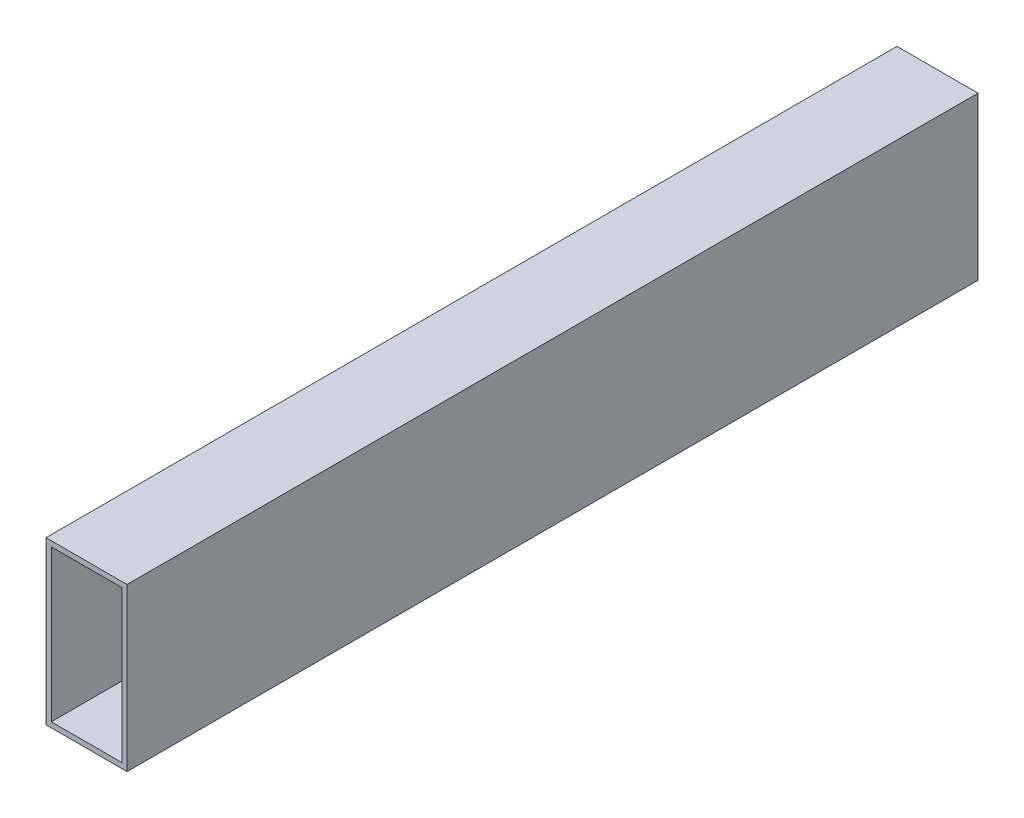
ISO-10303-21;
HEADER;
FILE_DESCRIPTION(('STEP AP214'),'2;1');
FILE_NAME('part.step','',(''),(''),'','','');
FILE_SCHEMA(('AUTOMOTIVE_DESIGN { 1 0 10303 214 1 1 1 1 }'));
ENDSEC;
DATA;
#1=APPLICATION_CONTEXT('core data for automotive mechanical design processes');
#2=APPLICATION_PROTOCOL_DEFINITION('international standard','automotive_design',2000,#1);
#3=PRODUCT_CONTEXT('',#1,'mechanical');
#4=PRODUCT('Part','Part','',(#3));
#5=PRODUCT_RELATED_PRODUCT_CATEGORY('part','',(#4));
#6=PRODUCT_DEFINITION_FORMATION('','',#4);
#7=PRODUCT_DEFINITION_CONTEXT('part definition',#1,'design');
#8=PRODUCT_DEFINITION('design','',#6,#7);
#9=PRODUCT_DEFINITION_SHAPE('','',#8);
#10=(LENGTH_UNIT() NAMED_UNIT(*) SI_UNIT(.MILLI.,.METRE.));
#11=(NAMED_UNIT(*) PLANE_ANGLE_UNIT() SI_UNIT($,.RADIAN.));
#12=(NAMED_UNIT(*) SI_UNIT($,.STERADIAN.) SOLID_ANGLE_UNIT());
#13=UNCERTAINTY_MEASURE_WITH_UNIT(LENGTH_MEASURE(1.E-05),#10,'distance_accuracy_value','');
#14=(GEOMETRIC_REPRESENTATION_CONTEXT(3) GLOBAL_UNCERTAINTY_ASSIGNED_CONTEXT((#13)) GLOBAL_UNIT_ASSIGNED_CONTEXT((#10,
#11,#12)) REPRESENTATION_CONTEXT('',''));
#15=CARTESIAN_POINT('',(0.,0.,0.));
#16=DIRECTION('',(0.,0.,1.));
#17=DIRECTION('',(1.,0.,0.));
#18=AXIS2_PLACEMENT_3D('',#15,#16,#17);
#19=CARTESIAN_POINT('',(-48.4372093023255,-30.1994186046511,266.7));
#20=DIRECTION('',(1.,0.,0.));
#21=DIRECTION('',(0.,0.,-1.));
#22=AXIS2_PLACEMENT_3D('',#19,#20,#21);
#23=PLANE('',#22);
#24=DIRECTION('',(0.,-1.,0.));
#25=VECTOR('',#24,1.);
#26=CARTESIAN_POINT('',(-48.4372093023255,-30.1994186046511,0.));
#27=LINE('',#26,#25);
#28=CARTESIAN_POINT('',(-48.4372093023255,20.6005813953489,0.));
#29=VERTEX_POINT('',#28);
#30=CARTESIAN_POINT('',(-48.4372093023255,-30.1994186046511,0.));
#31=VERTEX_POINT('',#30);
#32=EDGE_CURVE('E132',#29,#31,#27,.T.);
#33=ORIENTED_EDGE('',*,*,#32,.T.);
#34=DIRECTION('',(0.,0.,-1.));
#35=VECTOR('',#34,1.);
#36=CARTESIAN_POINT('',(-48.4372093023255,-30.1994186046511,266.7));
#37=LINE('',#36,#35);
#38=CARTESIAN_POINT('',(-48.4372093023255,-30.1994186046511,266.7));
#39=VERTEX_POINT('',#38);
#40=EDGE_CURVE('E11',#39,#31,#37,.T.);
#41=ORIENTED_EDGE('',*,*,#40,.F.);
#42=DIRECTION('',(0.,-1.,0.));
#43=VECTOR('',#42,1.);
#44=CARTESIAN_POINT('',(-48.4372093023255,-30.1994186046511,266.7));
#45=LINE('',#44,#43);
#46=CARTESIAN_POINT('',(-48.4372093023255,20.6005813953489,266.7));
#47=VERTEX_POINT('',#46);
#48=EDGE_CURVE('E136',#47,#39,#45,.T.);
#49=ORIENTED_EDGE('',*,*,#48,.F.);
#50=DIRECTION('',(0.,0.,-1.));
#51=VECTOR('',#50,1.);
#52=CARTESIAN_POINT('',(-48.4372093023255,20.6005813953489,266.7));
#53=LINE('',#52,#51);
#54=EDGE_CURVE('E146',#47,#29,#53,.T.);
#55=ORIENTED_EDGE('',*,*,#54,.T.);
#56=EDGE_LOOP('',(#33,#41,#49,#55));
#57=FACE_BOUND('',#56,.T.);
#58=ADVANCED_FACE('F35',(#57),#23,.F.);
#59=CARTESIAN_POINT('',(-48.4372093023255,-30.1994186046511,266.7));
#60=DIRECTION('',(0.,1.,0.));
#61=DIRECTION('',(0.,0.,1.));
#62=AXIS2_PLACEMENT_3D('',#59,#60,#61);
#63=PLANE('',#62);
#64=DIRECTION('',(1.,0.,0.));
#65=VECTOR('',#64,1.);
#66=CARTESIAN_POINT('',(-48.4372093023255,-30.1994186046511,0.));
#67=LINE('',#66,#65);
#68=CARTESIAN_POINT('',(-23.0372093023255,-30.1994186046511,0.));
#69=VERTEX_POINT('',#68);
#70=EDGE_CURVE('E149',#31,#69,#67,.T.);
#71=ORIENTED_EDGE('',*,*,#70,.T.);
#72=DIRECTION('',(0.,0.,-1.));
#73=VECTOR('',#72,1.);
#74=CARTESIAN_POINT('',(-23.0372093023255,-30.1994186046511,266.7));
#75=LINE('',#74,#73);
#76=CARTESIAN_POINT('',(-23.0372093023255,-30.1994186046511,266.7));
#77=VERTEX_POINT('',#76);
#78=EDGE_CURVE('E42',#77,#69,#75,.T.);
#79=ORIENTED_EDGE('',*,*,#78,.F.);
#80=DIRECTION('',(1.,0.,0.));
#81=VECTOR('',#80,1.);
#82=CARTESIAN_POINT('',(-48.4372093023255,-30.1994186046511,266.7));
#83=LINE('',#82,#81);
#84=EDGE_CURVE('E139',#39,#77,#83,.T.);
#85=ORIENTED_EDGE('',*,*,#84,.F.);
#86=ORIENTED_EDGE('',*,*,#40,.T.);
#87=EDGE_LOOP('',(#71,#79,#85,#86));
#88=FACE_BOUND('',#87,.T.);
#89=ADVANCED_FACE('F177',(#88),#63,.F.);
#90=CARTESIAN_POINT('',(-23.0372093023255,-30.1994186046511,266.7));
#91=DIRECTION('',(-1.,0.,0.));
#92=DIRECTION('',(0.,-1.,0.));
#93=AXIS2_PLACEMENT_3D('',#90,#91,#92);
#94=PLANE('',#93);
#95=DIRECTION('',(0.,1.,0.));
#96=VECTOR('',#95,1.);
#97=CARTESIAN_POINT('',(-23.0372093023255,-30.1994186046511,0.));
#98=LINE('',#97,#96);
#99=CARTESIAN_POINT('',(-23.0372093023255,20.6005813953489,0.));
#100=VERTEX_POINT('',#99);
#101=EDGE_CURVE('E151',#69,#100,#98,.T.);
#102=ORIENTED_EDGE('',*,*,#101,.T.);
#103=DIRECTION('',(0.,0.,-1.));
#104=VECTOR('',#103,1.);
#105=CARTESIAN_POINT('',(-23.0372093023255,20.6005813953489,266.7));
#106=LINE('',#105,#104);
#107=CARTESIAN_POINT('',(-23.0372093023255,20.6005813953489,266.7));
#108=VERTEX_POINT('',#107);
#109=EDGE_CURVE('E156',#108,#100,#106,.T.);
#110=ORIENTED_EDGE('',*,*,#109,.F.);
#111=DIRECTION('',(0.,1.,0.));
#112=VECTOR('',#111,1.);
#113=CARTESIAN_POINT('',(-23.0372093023255,-30.1994186046511,266.7));
#114=LINE('',#113,#112);
#115=EDGE_CURVE('E142',#77,#108,#114,.T.);
#116=ORIENTED_EDGE('',*,*,#115,.F.);
#117=ORIENTED_EDGE('',*,*,#78,.T.);
#118=EDGE_LOOP('',(#102,#110,#116,#117));
#119=FACE_BOUND('',#118,.T.);
#120=ADVANCED_FACE('F163',(#119),#94,.F.);
#121=CARTESIAN_POINT('',(-48.4372093023255,20.6005813953489,266.7));
#122=DIRECTION('',(0.,-1.,0.));
#123=DIRECTION('',(0.,0.,-1.));
#124=AXIS2_PLACEMENT_3D('',#121,#122,#123);
#125=PLANE('',#124);
#126=DIRECTION('',(-1.,0.,0.));
#127=VECTOR('',#126,1.);
#128=CARTESIAN_POINT('',(-48.4372093023255,20.6005813953489,0.));
#129=LINE('',#128,#127);
#130=EDGE_CURVE('E140',#100,#29,#129,.T.);
#131=ORIENTED_EDGE('',*,*,#130,.T.);
#132=ORIENTED_EDGE('',*,*,#54,.F.);
#133=DIRECTION('',(-1.,0.,0.));
#134=VECTOR('',#133,1.);
#135=CARTESIAN_POINT('',(-48.4372093023255,20.6005813953489,266.7));
#136=LINE('',#135,#134);
#137=EDGE_CURVE('E144',#108,#47,#136,.T.);
#138=ORIENTED_EDGE('',*,*,#137,.F.);
#139=ORIENTED_EDGE('',*,*,#109,.T.);
#140=EDGE_LOOP('',(#131,#132,#138,#139));
#141=FACE_BOUND('',#140,.T.);
#142=ADVANCED_FACE('F170',(#141),#125,.F.);
#143=CARTESIAN_POINT('',(0.,0.,266.7));
#144=DIRECTION('',(0.,0.,-1.));
#145=DIRECTION('',(-1.,0.,0.));
#146=AXIS2_PLACEMENT_3D('',#143,#144,#145);
#147=PLANE('',#146);
#148=DIRECTION('',(-1.,0.,0.));
#149=VECTOR('',#148,1.);
#150=CARTESIAN_POINT('',(-46.7862093023255,18.9495813953489,266.7));
#151=LINE('',#150,#149);
#152=CARTESIAN_POINT('',(-24.6882093023255,18.9495813953489,266.7));
#153=VERTEX_POINT('',#152);
#154=CARTESIAN_POINT('',(-46.7862093023255,18.9495813953489,266.7));
#155=VERTEX_POINT('',#154);
#156=EDGE_CURVE('E126',#153,#155,#151,.T.);
#157=ORIENTED_EDGE('',*,*,#156,.F.);
#158=DIRECTION('',(0.,1.,0.));
#159=VECTOR('',#158,1.);
#160=CARTESIAN_POINT('',(-24.6882093023255,18.9495813953489,266.7));
#161=LINE('',#160,#159);
#162=CARTESIAN_POINT('',(-24.6882093023255,-28.5484186046511,266.7));
#163=VERTEX_POINT('',#162);
#164=EDGE_CURVE('E49',#163,#153,#161,.T.);
#165=ORIENTED_EDGE('',*,*,#164,.F.);
#166=DIRECTION('',(1.,0.,0.));
#167=VECTOR('',#166,1.);
#168=CARTESIAN_POINT('',(-46.7862093023255,-28.5484186046511,266.7));
#169=LINE('',#168,#167);
#170=CARTESIAN_POINT('',(-46.7862093023255,-28.5484186046511,266.7));
#171=VERTEX_POINT('',#170);
#172=EDGE_CURVE('E117',#171,#163,#169,.T.);
#173=ORIENTED_EDGE('',*,*,#172,.F.);
#174=DIRECTION('',(0.,-1.,0.));
#175=VECTOR('',#174,1.);
#176=CARTESIAN_POINT('',(-46.7862093023255,18.9495813953489,266.7));
#177=LINE('',#176,#175);
#178=EDGE_CURVE('E120',#155,#171,#177,.T.);
#179=ORIENTED_EDGE('',*,*,#178,.F.);
#180=EDGE_LOOP('',(#157,#165,#173,#179));
#181=FACE_BOUND('',#180,.T.);
#182=ORIENTED_EDGE('',*,*,#48,.T.);
#183=ORIENTED_EDGE('',*,*,#84,.T.);
#184=ORIENTED_EDGE('',*,*,#115,.T.);
#185=ORIENTED_EDGE('',*,*,#137,.T.);
#186=EDGE_LOOP('',(#182,#183,#184,#185));
#187=FACE_BOUND('',#186,.T.);
#188=ADVANCED_FACE('F176',(#181,#187),#147,.F.);
#189=CARTESIAN_POINT('',(0.,0.,0.));
#190=DIRECTION('',(0.,0.,-1.));
#191=DIRECTION('',(-1.,0.,0.));
#192=AXIS2_PLACEMENT_3D('',#189,#190,#191);
#193=PLANE('',#192);
#194=DIRECTION('',(0.,1.,0.));
#195=VECTOR('',#194,1.);
#196=CARTESIAN_POINT('',(-24.6882093023255,18.9495813953489,0.));
#197=LINE('',#196,#195);
#198=CARTESIAN_POINT('',(-24.6882093023255,-28.5484186046511,0.));
#199=VERTEX_POINT('',#198);
#200=CARTESIAN_POINT('',(-24.6882093023255,18.9495813953489,0.));
#201=VERTEX_POINT('',#200);
#202=EDGE_CURVE('E101',#199,#201,#197,.T.);
#203=ORIENTED_EDGE('',*,*,#202,.T.);
#204=DIRECTION('',(-1.,0.,0.));
#205=VECTOR('',#204,1.);
#206=CARTESIAN_POINT('',(-46.7862093023255,18.9495813953489,0.));
#207=LINE('',#206,#205);
#208=CARTESIAN_POINT('',(-46.7862093023255,18.9495813953489,0.));
#209=VERTEX_POINT('',#208);
#210=EDGE_CURVE('E110',#201,#209,#207,.T.);
#211=ORIENTED_EDGE('',*,*,#210,.T.);
#212=DIRECTION('',(0.,-1.,0.));
#213=VECTOR('',#212,1.);
#214=CARTESIAN_POINT('',(-46.7862093023255,18.9495813953489,0.));
#215=LINE('',#214,#213);
#216=CARTESIAN_POINT('',(-46.7862093023255,-28.5484186046511,0.));
#217=VERTEX_POINT('',#216);
#218=EDGE_CURVE('E57',#209,#217,#215,.T.);
#219=ORIENTED_EDGE('',*,*,#218,.T.);
#220=DIRECTION('',(1.,0.,0.));
#221=VECTOR('',#220,1.);
#222=CARTESIAN_POINT('',(-46.7862093023255,-28.5484186046511,0.));
#223=LINE('',#222,#221);
#224=EDGE_CURVE('E107',#217,#199,#223,.T.);
#225=ORIENTED_EDGE('',*,*,#224,.T.);
#226=EDGE_LOOP('',(#203,#211,#219,#225));
#227=FACE_BOUND('',#226,.T.);
#228=ORIENTED_EDGE('',*,*,#32,.F.);
#229=ORIENTED_EDGE('',*,*,#130,.F.);
#230=ORIENTED_EDGE('',*,*,#101,.F.);
#231=ORIENTED_EDGE('',*,*,#70,.F.);
#232=EDGE_LOOP('',(#228,#229,#230,#231));
#233=FACE_BOUND('',#232,.T.);
#234=ADVANCED_FACE('F114',(#227,#233),#193,.T.);
#235=CARTESIAN_POINT('',(-24.6882093023255,18.9495813953489,0.));
#236=DIRECTION('',(1.,0.,0.));
#237=DIRECTION('',(0.,1.,0.));
#238=AXIS2_PLACEMENT_3D('',#235,#236,#237);
#239=PLANE('',#238);
#240=ORIENTED_EDGE('',*,*,#164,.T.);
#241=DIRECTION('',(0.,0.,1.));
#242=VECTOR('',#241,1.);
#243=CARTESIAN_POINT('',(-24.6882093023255,18.9495813953489,0.));
#244=LINE('',#243,#242);
#245=EDGE_CURVE('E97',#201,#153,#244,.T.);
#246=ORIENTED_EDGE('',*,*,#245,.F.);
#247=ORIENTED_EDGE('',*,*,#202,.F.);
#248=DIRECTION('',(0.,0.,1.));
#249=VECTOR('',#248,1.);
#250=CARTESIAN_POINT('',(-24.6882093023255,-28.5484186046511,0.));
#251=LINE('',#250,#249);
#252=EDGE_CURVE('E130',#199,#163,#251,.T.);
#253=ORIENTED_EDGE('',*,*,#252,.T.);
#254=EDGE_LOOP('',(#240,#246,#247,#253));
#255=FACE_BOUND('',#254,.T.);
#256=ADVANCED_FACE('F99',(#255),#239,.F.);
#257=CARTESIAN_POINT('',(-46.7862093023255,-28.5484186046511,0.));
#258=DIRECTION('',(0.,-1.,0.));
#259=DIRECTION('',(0.,0.,-1.));
#260=AXIS2_PLACEMENT_3D('',#257,#258,#259);
#261=PLANE('',#260);
#262=ORIENTED_EDGE('',*,*,#172,.T.);
#263=ORIENTED_EDGE('',*,*,#252,.F.);
#264=ORIENTED_EDGE('',*,*,#224,.F.);
#265=DIRECTION('',(0.,0.,1.));
#266=VECTOR('',#265,1.);
#267=CARTESIAN_POINT('',(-46.7862093023255,-28.5484186046511,0.));
#268=LINE('',#267,#266);
#269=EDGE_CURVE('E133',#217,#171,#268,.T.);
#270=ORIENTED_EDGE('',*,*,#269,.T.);
#271=EDGE_LOOP('',(#262,#263,#264,#270));
#272=FACE_BOUND('',#271,.T.);
#273=ADVANCED_FACE('F194',(#272),#261,.F.);
#274=CARTESIAN_POINT('',(-46.7862093023255,18.9495813953489,0.));
#275=DIRECTION('',(-1.,0.,0.));
#276=DIRECTION('',(0.,-1.,0.));
#277=AXIS2_PLACEMENT_3D('',#274,#275,#276);
#278=PLANE('',#277);
#279=ORIENTED_EDGE('',*,*,#178,.T.);
#280=ORIENTED_EDGE('',*,*,#269,.F.);
#281=ORIENTED_EDGE('',*,*,#218,.F.);
#282=DIRECTION('',(0.,0.,1.));
#283=VECTOR('',#282,1.);
#284=CARTESIAN_POINT('',(-46.7862093023255,18.9495813953489,0.));
#285=LINE('',#284,#283);
#286=EDGE_CURVE('E106',#209,#155,#285,.T.);
#287=ORIENTED_EDGE('',*,*,#286,.T.);
#288=EDGE_LOOP('',(#279,#280,#281,#287));
#289=FACE_BOUND('',#288,.T.);
#290=ADVANCED_FACE('F197',(#289),#278,.F.);
#291=CARTESIAN_POINT('',(-46.7862093023255,18.9495813953489,0.));
#292=DIRECTION('',(0.,1.,0.));
#293=DIRECTION('',(0.,0.,1.));
#294=AXIS2_PLACEMENT_3D('',#291,#292,#293);
#295=PLANE('',#294);
#296=ORIENTED_EDGE('',*,*,#156,.T.);
#297=ORIENTED_EDGE('',*,*,#286,.F.);
#298=ORIENTED_EDGE('',*,*,#210,.F.);
#299=ORIENTED_EDGE('',*,*,#245,.T.);
#300=EDGE_LOOP('',(#296,#297,#298,#299));
#301=FACE_BOUND('',#300,.T.);
#302=ADVANCED_FACE('F111',(#301),#295,.F.);
#303=CLOSED_SHELL('',(#58,#89,#120,#142,#188,#234,#256,#273,#290,#302));
#304=MANIFOLD_SOLID_BREP('B2',#303);
#305=ADVANCED_BREP_SHAPE_REPRESENTATION('',(#18,#304),#14);
#306=SHAPE_DEFINITION_REPRESENTATION(#9,#305);
ENDSEC;
END-ISO-10303-21;
